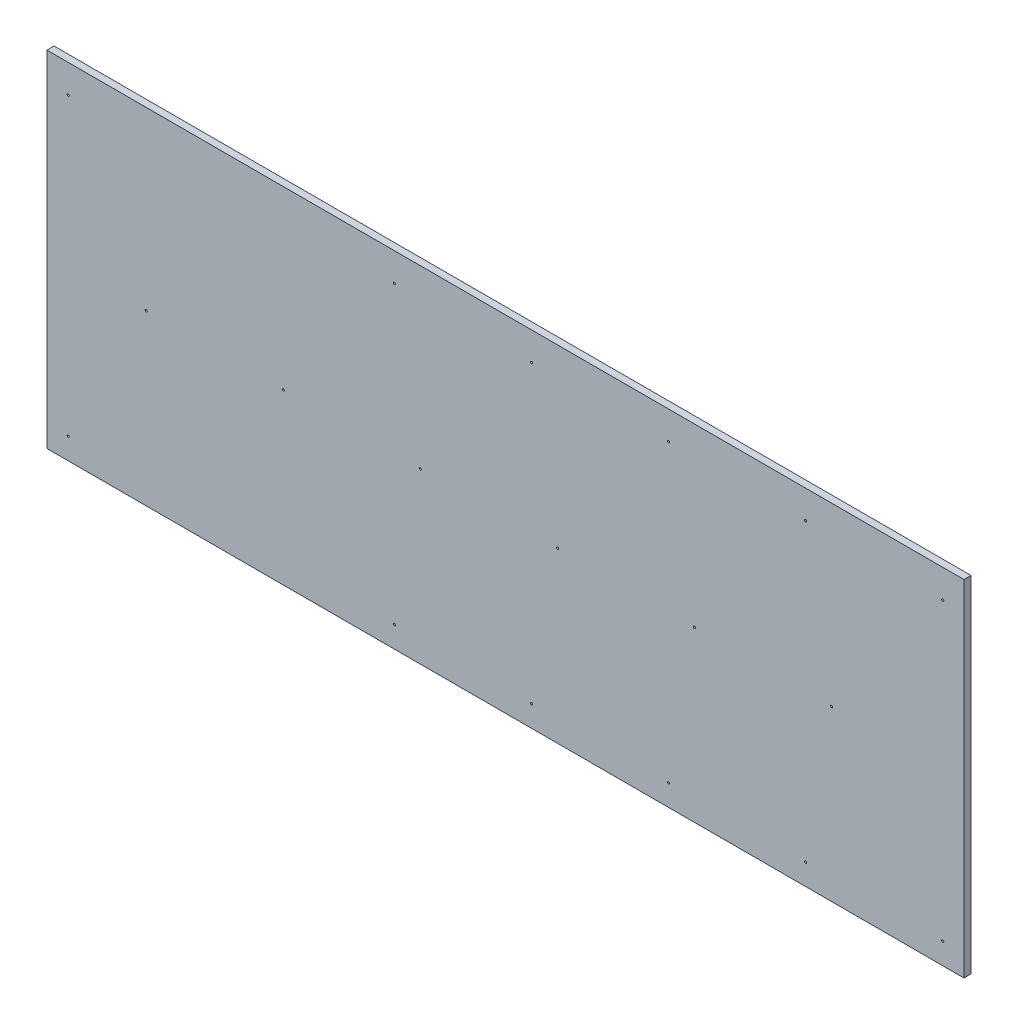
ISO-10303-21;
HEADER;
FILE_DESCRIPTION(('STEP AP214'),'2;1');
FILE_NAME('part.step','',(''),(''),'','','');
FILE_SCHEMA(('AUTOMOTIVE_DESIGN { 1 0 10303 214 1 1 1 1 }'));
ENDSEC;
DATA;
#1=APPLICATION_CONTEXT('core data for automotive mechanical design processes');
#2=APPLICATION_PROTOCOL_DEFINITION('international standard','automotive_design',2000,#1);
#3=PRODUCT_CONTEXT('',#1,'mechanical');
#4=PRODUCT('Part','Part','',(#3));
#5=PRODUCT_RELATED_PRODUCT_CATEGORY('part','',(#4));
#6=PRODUCT_DEFINITION_FORMATION('','',#4);
#7=PRODUCT_DEFINITION_CONTEXT('part definition',#1,'design');
#8=PRODUCT_DEFINITION('design','',#6,#7);
#9=PRODUCT_DEFINITION_SHAPE('','',#8);
#10=(LENGTH_UNIT() NAMED_UNIT(*) SI_UNIT(.MILLI.,.METRE.));
#11=(NAMED_UNIT(*) PLANE_ANGLE_UNIT() SI_UNIT($,.RADIAN.));
#12=(NAMED_UNIT(*) SI_UNIT($,.STERADIAN.) SOLID_ANGLE_UNIT());
#13=UNCERTAINTY_MEASURE_WITH_UNIT(LENGTH_MEASURE(1.E-05),#10,'distance_accuracy_value','');
#14=(GEOMETRIC_REPRESENTATION_CONTEXT(3) GLOBAL_UNCERTAINTY_ASSIGNED_CONTEXT((#13)) GLOBAL_UNIT_ASSIGNED_CONTEXT((#10,
#11,#12)) REPRESENTATION_CONTEXT('',''));
#15=CARTESIAN_POINT('',(0.,0.,0.));
#16=DIRECTION('',(0.,0.,1.));
#17=DIRECTION('',(1.,0.,0.));
#18=AXIS2_PLACEMENT_3D('',#15,#16,#17);
#19=CARTESIAN_POINT('',(-388.,-146.,6.));
#20=DIRECTION('',(1.,0.,0.));
#21=DIRECTION('',(0.,1.,0.));
#22=AXIS2_PLACEMENT_3D('',#19,#20,#21);
#23=PLANE('',#22);
#24=DIRECTION('',(0.,-1.,0.));
#25=VECTOR('',#24,1.);
#26=CARTESIAN_POINT('',(-388.,-146.,0.));
#27=LINE('',#26,#25);
#28=CARTESIAN_POINT('',(-388.,146.,0.));
#29=VERTEX_POINT('',#28);
#30=CARTESIAN_POINT('',(-388.,-146.,0.));
#31=VERTEX_POINT('',#30);
#32=EDGE_CURVE('E95',#29,#31,#27,.T.);
#33=ORIENTED_EDGE('',*,*,#32,.T.);
#34=DIRECTION('',(0.,0.,-1.));
#35=VECTOR('',#34,1.);
#36=CARTESIAN_POINT('',(-388.,-146.,6.));
#37=LINE('',#36,#35);
#38=CARTESIAN_POINT('',(-388.,-146.,6.));
#39=VERTEX_POINT('',#38);
#40=EDGE_CURVE('E11',#39,#31,#37,.T.);
#41=ORIENTED_EDGE('',*,*,#40,.F.);
#42=DIRECTION('',(0.,-1.,0.));
#43=VECTOR('',#42,1.);
#44=CARTESIAN_POINT('',(-388.,-146.,6.));
#45=LINE('',#44,#43);
#46=CARTESIAN_POINT('',(-388.,146.,6.));
#47=VERTEX_POINT('',#46);
#48=EDGE_CURVE('E83',#47,#39,#45,.T.);
#49=ORIENTED_EDGE('',*,*,#48,.F.);
#50=DIRECTION('',(0.,0.,-1.));
#51=VECTOR('',#50,1.);
#52=CARTESIAN_POINT('',(-388.,146.,6.));
#53=LINE('',#52,#51);
#54=EDGE_CURVE('E91',#47,#29,#53,.T.);
#55=ORIENTED_EDGE('',*,*,#54,.T.);
#56=EDGE_LOOP('',(#33,#41,#49,#55));
#57=FACE_BOUND('',#56,.T.);
#58=ADVANCED_FACE('F32',(#57),#23,.F.);
#59=CARTESIAN_POINT('',(388.,-146.,6.));
#60=DIRECTION('',(0.,1.,0.));
#61=DIRECTION('',(-1.,0.,0.));
#62=AXIS2_PLACEMENT_3D('',#59,#60,#61);
#63=PLANE('',#62);
#64=DIRECTION('',(1.,0.,0.));
#65=VECTOR('',#64,1.);
#66=CARTESIAN_POINT('',(388.,-146.,0.));
#67=LINE('',#66,#65);
#68=CARTESIAN_POINT('',(388.,-146.,0.));
#69=VERTEX_POINT('',#68);
#70=EDGE_CURVE('E87',#31,#69,#67,.T.);
#71=ORIENTED_EDGE('',*,*,#70,.T.);
#72=DIRECTION('',(0.,0.,-1.));
#73=VECTOR('',#72,1.);
#74=CARTESIAN_POINT('',(388.,-146.,6.));
#75=LINE('',#74,#73);
#76=CARTESIAN_POINT('',(388.,-146.,6.));
#77=VERTEX_POINT('',#76);
#78=EDGE_CURVE('E40',#77,#69,#75,.T.);
#79=ORIENTED_EDGE('',*,*,#78,.F.);
#80=DIRECTION('',(1.,0.,0.));
#81=VECTOR('',#80,1.);
#82=CARTESIAN_POINT('',(388.,-146.,6.));
#83=LINE('',#82,#81);
#84=EDGE_CURVE('E78',#39,#77,#83,.T.);
#85=ORIENTED_EDGE('',*,*,#84,.F.);
#86=ORIENTED_EDGE('',*,*,#40,.T.);
#87=EDGE_LOOP('',(#71,#79,#85,#86));
#88=FACE_BOUND('',#87,.T.);
#89=ADVANCED_FACE('F86',(#88),#63,.F.);
#90=CARTESIAN_POINT('',(388.,-146.,6.));
#91=DIRECTION('',(-1.,0.,0.));
#92=DIRECTION('',(0.,0.,1.));
#93=AXIS2_PLACEMENT_3D('',#90,#91,#92);
#94=PLANE('',#93);
#95=DIRECTION('',(0.,1.,0.));
#96=VECTOR('',#95,1.);
#97=CARTESIAN_POINT('',(388.,-146.,0.));
#98=LINE('',#97,#96);
#99=CARTESIAN_POINT('',(388.,146.,0.));
#100=VERTEX_POINT('',#99);
#101=EDGE_CURVE('E65',#69,#100,#98,.T.);
#102=ORIENTED_EDGE('',*,*,#101,.T.);
#103=DIRECTION('',(0.,0.,-1.));
#104=VECTOR('',#103,1.);
#105=CARTESIAN_POINT('',(388.,146.,6.));
#106=LINE('',#105,#104);
#107=CARTESIAN_POINT('',(388.,146.,6.));
#108=VERTEX_POINT('',#107);
#109=EDGE_CURVE('E88',#108,#100,#106,.T.);
#110=ORIENTED_EDGE('',*,*,#109,.F.);
#111=DIRECTION('',(0.,1.,0.));
#112=VECTOR('',#111,1.);
#113=CARTESIAN_POINT('',(388.,-146.,6.));
#114=LINE('',#113,#112);
#115=EDGE_CURVE('E81',#77,#108,#114,.T.);
#116=ORIENTED_EDGE('',*,*,#115,.F.);
#117=ORIENTED_EDGE('',*,*,#78,.T.);
#118=EDGE_LOOP('',(#102,#110,#116,#117));
#119=FACE_BOUND('',#118,.T.);
#120=ADVANCED_FACE('F89',(#119),#94,.F.);
#121=CARTESIAN_POINT('',(388.,146.,6.));
#122=DIRECTION('',(0.,-1.,0.));
#123=DIRECTION('',(1.,0.,0.));
#124=AXIS2_PLACEMENT_3D('',#121,#122,#123);
#125=PLANE('',#124);
#126=DIRECTION('',(-1.,0.,0.));
#127=VECTOR('',#126,1.);
#128=CARTESIAN_POINT('',(388.,146.,0.));
#129=LINE('',#128,#127);
#130=EDGE_CURVE('E71',#100,#29,#129,.T.);
#131=ORIENTED_EDGE('',*,*,#130,.T.);
#132=ORIENTED_EDGE('',*,*,#54,.F.);
#133=DIRECTION('',(-1.,0.,0.));
#134=VECTOR('',#133,1.);
#135=CARTESIAN_POINT('',(388.,146.,6.));
#136=LINE('',#135,#134);
#137=EDGE_CURVE('E48',#108,#47,#136,.T.);
#138=ORIENTED_EDGE('',*,*,#137,.F.);
#139=ORIENTED_EDGE('',*,*,#109,.T.);
#140=EDGE_LOOP('',(#131,#132,#138,#139));
#141=FACE_BOUND('',#140,.T.);
#142=ADVANCED_FACE('F103',(#141),#125,.F.);
#143=CARTESIAN_POINT('',(0.,0.,6.));
#144=DIRECTION('',(0.,0.,1.));
#145=DIRECTION('',(1.,0.,0.));
#146=AXIS2_PLACEMENT_3D('',#143,#144,#145);
#147=PLANE('',#146);
#148=CARTESIAN_POINT('',(-71.9999999999997,-2.99999999999988,6.));
#149=DIRECTION('',(0.,0.,-1.));
#150=DIRECTION('',(-1.,0.,0.));
#151=AXIS2_PLACEMENT_3D('',#148,#149,#150);
#152=CIRCLE('',#151,0.900000000000005);
#153=CARTESIAN_POINT('',(-72.8999999999997,-2.99999999999988,6.));
#154=VERTEX_POINT('',#153);
#155=EDGE_CURVE('E173',#154,#154,#152,.T.);
#156=ORIENTED_EDGE('',*,*,#155,.T.);
#157=EDGE_LOOP('',(#156));
#158=FACE_BOUND('',#157,.T.);
#159=CARTESIAN_POINT('',(-93.9999999999997,-128.,6.));
#160=DIRECTION('',(0.,0.,-1.));
#161=DIRECTION('',(-1.,0.,0.));
#162=AXIS2_PLACEMENT_3D('',#159,#160,#161);
#163=CIRCLE('',#162,0.900000000000007);
#164=CARTESIAN_POINT('',(-94.8999999999997,-128.,6.));
#165=VERTEX_POINT('',#164);
#166=EDGE_CURVE('E166',#165,#165,#163,.T.);
#167=ORIENTED_EDGE('',*,*,#166,.T.);
#168=EDGE_LOOP('',(#167));
#169=FACE_BOUND('',#168,.T.);
#170=CARTESIAN_POINT('',(-93.9999999999997,122.,6.));
#171=DIRECTION('',(0.,0.,-1.));
#172=DIRECTION('',(-1.,0.,0.));
#173=AXIS2_PLACEMENT_3D('',#170,#171,#172);
#174=CIRCLE('',#173,0.900000000000003);
#175=CARTESIAN_POINT('',(-94.8999999999997,122.,6.));
#176=VERTEX_POINT('',#175);
#177=EDGE_CURVE('E167',#176,#176,#174,.T.);
#178=ORIENTED_EDGE('',*,*,#177,.T.);
#179=EDGE_LOOP('',(#178));
#180=FACE_BOUND('',#179,.T.);
#181=CARTESIAN_POINT('',(-188.,-2.99999999999988,6.));
#182=DIRECTION('',(0.,0.,-1.));
#183=DIRECTION('',(-1.,0.,0.));
#184=AXIS2_PLACEMENT_3D('',#181,#182,#183);
#185=CIRCLE('',#184,0.900000000000005);
#186=CARTESIAN_POINT('',(-188.9,-2.99999999999988,6.));
#187=VERTEX_POINT('',#186);
#188=EDGE_CURVE('E186',#187,#187,#185,.T.);
#189=ORIENTED_EDGE('',*,*,#188,.T.);
#190=EDGE_LOOP('',(#189));
#191=FACE_BOUND('',#190,.T.);
#192=CARTESIAN_POINT('',(-304.,-2.99999999999988,6.));
#193=DIRECTION('',(0.,0.,-1.));
#194=DIRECTION('',(-1.,0.,0.));
#195=AXIS2_PLACEMENT_3D('',#192,#193,#194);
#196=CIRCLE('',#195,0.900000000000005);
#197=CARTESIAN_POINT('',(-304.9,-2.99999999999988,6.));
#198=VERTEX_POINT('',#197);
#199=EDGE_CURVE('E180',#198,#198,#196,.T.);
#200=ORIENTED_EDGE('',*,*,#199,.T.);
#201=EDGE_LOOP('',(#200));
#202=FACE_BOUND('',#201,.T.);
#203=CARTESIAN_POINT('',(22.0000000000003,122.,6.));
#204=DIRECTION('',(0.,0.,-1.));
#205=DIRECTION('',(-1.,0.,0.));
#206=AXIS2_PLACEMENT_3D('',#203,#204,#205);
#207=CIRCLE('',#206,0.900000000000003);
#208=CARTESIAN_POINT('',(21.1000000000003,122.,6.));
#209=VERTEX_POINT('',#208);
#210=EDGE_CURVE('E196',#209,#209,#207,.T.);
#211=ORIENTED_EDGE('',*,*,#210,.T.);
#212=EDGE_LOOP('',(#211));
#213=FACE_BOUND('',#212,.T.);
#214=CARTESIAN_POINT('',(22.0000000000003,-128.,6.));
#215=DIRECTION('',(0.,0.,-1.));
#216=DIRECTION('',(-1.,0.,0.));
#217=AXIS2_PLACEMENT_3D('',#214,#215,#216);
#218=CIRCLE('',#217,0.900000000000007);
#219=CARTESIAN_POINT('',(21.1000000000003,-128.,6.));
#220=VERTEX_POINT('',#219);
#221=EDGE_CURVE('E202',#220,#220,#218,.T.);
#222=ORIENTED_EDGE('',*,*,#221,.T.);
#223=EDGE_LOOP('',(#222));
#224=FACE_BOUND('',#223,.T.);
#225=CARTESIAN_POINT('',(44.0000000000003,-2.99999999999988,6.));
#226=DIRECTION('',(0.,0.,-1.));
#227=DIRECTION('',(-1.,0.,0.));
#228=AXIS2_PLACEMENT_3D('',#225,#226,#227);
#229=CIRCLE('',#228,0.900000000000005);
#230=CARTESIAN_POINT('',(43.1000000000003,-2.99999999999988,6.));
#231=VERTEX_POINT('',#230);
#232=EDGE_CURVE('E208',#231,#231,#229,.T.);
#233=ORIENTED_EDGE('',*,*,#232,.T.);
#234=EDGE_LOOP('',(#233));
#235=FACE_BOUND('',#234,.T.);
#236=CARTESIAN_POINT('',(138.,122.,6.));
#237=DIRECTION('',(0.,0.,-1.));
#238=DIRECTION('',(-1.,0.,0.));
#239=AXIS2_PLACEMENT_3D('',#236,#237,#238);
#240=CIRCLE('',#239,0.900000000000003);
#241=CARTESIAN_POINT('',(137.1,122.,6.));
#242=VERTEX_POINT('',#241);
#243=EDGE_CURVE('E143',#242,#242,#240,.T.);
#244=ORIENTED_EDGE('',*,*,#243,.T.);
#245=EDGE_LOOP('',(#244));
#246=FACE_BOUND('',#245,.T.);
#247=CARTESIAN_POINT('',(276.,-2.99999999999988,6.));
#248=DIRECTION('',(0.,0.,-1.));
#249=DIRECTION('',(-1.,0.,0.));
#250=AXIS2_PLACEMENT_3D('',#247,#248,#249);
#251=CIRCLE('',#250,0.900000000000005);
#252=CARTESIAN_POINT('',(275.1,-2.99999999999988,6.));
#253=VERTEX_POINT('',#252);
#254=EDGE_CURVE('E130',#253,#253,#251,.T.);
#255=ORIENTED_EDGE('',*,*,#254,.T.);
#256=EDGE_LOOP('',(#255));
#257=FACE_BOUND('',#256,.T.);
#258=CARTESIAN_POINT('',(-370.,122.,6.));
#259=DIRECTION('',(0.,0.,-1.));
#260=DIRECTION('',(-1.,0.,0.));
#261=AXIS2_PLACEMENT_3D('',#258,#259,#260);
#262=CIRCLE('',#261,0.900000000000003);
#263=CARTESIAN_POINT('',(-370.9,122.,6.));
#264=VERTEX_POINT('',#263);
#265=EDGE_CURVE('E119',#264,#264,#262,.T.);
#266=ORIENTED_EDGE('',*,*,#265,.T.);
#267=EDGE_LOOP('',(#266));
#268=FACE_BOUND('',#267,.T.);
#269=CARTESIAN_POINT('',(-370.,-128.,6.));
#270=DIRECTION('',(0.,0.,-1.));
#271=DIRECTION('',(-1.,0.,0.));
#272=AXIS2_PLACEMENT_3D('',#269,#270,#271);
#273=CIRCLE('',#272,0.900000000000007);
#274=CARTESIAN_POINT('',(-370.9,-128.,6.));
#275=VERTEX_POINT('',#274);
#276=EDGE_CURVE('E118',#275,#275,#273,.T.);
#277=ORIENTED_EDGE('',*,*,#276,.T.);
#278=EDGE_LOOP('',(#277));
#279=FACE_BOUND('',#278,.T.);
#280=CARTESIAN_POINT('',(370.,122.,6.));
#281=DIRECTION('',(0.,0.,-1.));
#282=DIRECTION('',(-1.,0.,0.));
#283=AXIS2_PLACEMENT_3D('',#280,#281,#282);
#284=CIRCLE('',#283,0.900000000000003);
#285=CARTESIAN_POINT('',(369.1,122.,6.));
#286=VERTEX_POINT('',#285);
#287=EDGE_CURVE('E112',#286,#286,#284,.T.);
#288=ORIENTED_EDGE('',*,*,#287,.T.);
#289=EDGE_LOOP('',(#288));
#290=FACE_BOUND('',#289,.T.);
#291=CARTESIAN_POINT('',(254.,-128.,6.));
#292=DIRECTION('',(0.,0.,-1.));
#293=DIRECTION('',(-1.,0.,0.));
#294=AXIS2_PLACEMENT_3D('',#291,#292,#293);
#295=CIRCLE('',#294,0.900000000000007);
#296=CARTESIAN_POINT('',(253.1,-128.,6.));
#297=VERTEX_POINT('',#296);
#298=EDGE_CURVE('E131',#297,#297,#295,.T.);
#299=ORIENTED_EDGE('',*,*,#298,.T.);
#300=EDGE_LOOP('',(#299));
#301=FACE_BOUND('',#300,.T.);
#302=CARTESIAN_POINT('',(254.,122.,6.));
#303=DIRECTION('',(0.,0.,-1.));
#304=DIRECTION('',(-1.,0.,0.));
#305=AXIS2_PLACEMENT_3D('',#302,#303,#304);
#306=CIRCLE('',#305,0.900000000000003);
#307=CARTESIAN_POINT('',(253.1,122.,6.));
#308=VERTEX_POINT('',#307);
#309=EDGE_CURVE('E155',#308,#308,#306,.T.);
#310=ORIENTED_EDGE('',*,*,#309,.T.);
#311=EDGE_LOOP('',(#310));
#312=FACE_BOUND('',#311,.T.);
#313=CARTESIAN_POINT('',(160.,-2.99999999999988,6.));
#314=DIRECTION('',(0.,0.,-1.));
#315=DIRECTION('',(-1.,0.,0.));
#316=AXIS2_PLACEMENT_3D('',#313,#314,#315);
#317=CIRCLE('',#316,0.900000000000005);
#318=CARTESIAN_POINT('',(159.1,-2.99999999999988,6.));
#319=VERTEX_POINT('',#318);
#320=EDGE_CURVE('E149',#319,#319,#317,.T.);
#321=ORIENTED_EDGE('',*,*,#320,.T.);
#322=EDGE_LOOP('',(#321));
#323=FACE_BOUND('',#322,.T.);
#324=CARTESIAN_POINT('',(138.,-128.,6.));
#325=DIRECTION('',(0.,0.,-1.));
#326=DIRECTION('',(-1.,0.,0.));
#327=AXIS2_PLACEMENT_3D('',#324,#325,#326);
#328=CIRCLE('',#327,0.900000000000007);
#329=CARTESIAN_POINT('',(137.1,-128.,6.));
#330=VERTEX_POINT('',#329);
#331=EDGE_CURVE('E142',#330,#330,#328,.T.);
#332=ORIENTED_EDGE('',*,*,#331,.T.);
#333=EDGE_LOOP('',(#332));
#334=FACE_BOUND('',#333,.T.);
#335=CARTESIAN_POINT('',(370.,-128.,6.));
#336=DIRECTION('',(0.,0.,-1.));
#337=DIRECTION('',(-1.,0.,0.));
#338=AXIS2_PLACEMENT_3D('',#335,#336,#337);
#339=CIRCLE('',#338,0.900000000000007);
#340=CARTESIAN_POINT('',(369.1,-128.,6.));
#341=VERTEX_POINT('',#340);
#342=EDGE_CURVE('E98',#341,#341,#339,.T.);
#343=ORIENTED_EDGE('',*,*,#342,.T.);
#344=EDGE_LOOP('',(#343));
#345=FACE_BOUND('',#344,.T.);
#346=ORIENTED_EDGE('',*,*,#48,.T.);
#347=ORIENTED_EDGE('',*,*,#84,.T.);
#348=ORIENTED_EDGE('',*,*,#115,.T.);
#349=ORIENTED_EDGE('',*,*,#137,.T.);
#350=EDGE_LOOP('',(#346,#347,#348,#349));
#351=FACE_BOUND('',#350,.T.);
#352=ADVANCED_FACE('F79',(#158,#169,#180,#191,#202,#213,#224,#235,#246,#257,#268,#279,#290,#301,
#312,#323,#334,#345,#351),#147,.T.);
#353=CARTESIAN_POINT('',(0.,0.,0.));
#354=DIRECTION('',(0.,0.,1.));
#355=DIRECTION('',(1.,0.,0.));
#356=AXIS2_PLACEMENT_3D('',#353,#354,#355);
#357=PLANE('',#356);
#358=CARTESIAN_POINT('',(-71.9999999999997,-2.99999999999988,0.));
#359=DIRECTION('',(0.,0.,-1.));
#360=DIRECTION('',(-1.,0.,0.));
#361=AXIS2_PLACEMENT_3D('',#358,#359,#360);
#362=CIRCLE('',#361,0.900000000000005);
#363=CARTESIAN_POINT('',(-72.8999999999997,-2.99999999999988,0.));
#364=VERTEX_POINT('',#363);
#365=EDGE_CURVE('E170',#364,#364,#362,.T.);
#366=ORIENTED_EDGE('',*,*,#365,.F.);
#367=EDGE_LOOP('',(#366));
#368=FACE_BOUND('',#367,.T.);
#369=CARTESIAN_POINT('',(-93.9999999999997,-128.,0.));
#370=DIRECTION('',(0.,0.,-1.));
#371=DIRECTION('',(-1.,0.,0.));
#372=AXIS2_PLACEMENT_3D('',#369,#370,#371);
#373=CIRCLE('',#372,0.900000000000007);
#374=CARTESIAN_POINT('',(-94.8999999999997,-128.,0.));
#375=VERTEX_POINT('',#374);
#376=EDGE_CURVE('E163',#375,#375,#373,.T.);
#377=ORIENTED_EDGE('',*,*,#376,.F.);
#378=EDGE_LOOP('',(#377));
#379=FACE_BOUND('',#378,.T.);
#380=CARTESIAN_POINT('',(-93.9999999999997,122.,0.));
#381=DIRECTION('',(0.,0.,-1.));
#382=DIRECTION('',(-1.,0.,0.));
#383=AXIS2_PLACEMENT_3D('',#380,#381,#382);
#384=CIRCLE('',#383,0.900000000000003);
#385=CARTESIAN_POINT('',(-94.8999999999997,122.,0.));
#386=VERTEX_POINT('',#385);
#387=EDGE_CURVE('E189',#386,#386,#384,.T.);
#388=ORIENTED_EDGE('',*,*,#387,.F.);
#389=EDGE_LOOP('',(#388));
#390=FACE_BOUND('',#389,.T.);
#391=CARTESIAN_POINT('',(-188.,-2.99999999999988,0.));
#392=DIRECTION('',(0.,0.,-1.));
#393=DIRECTION('',(-1.,0.,0.));
#394=AXIS2_PLACEMENT_3D('',#391,#392,#393);
#395=CIRCLE('',#394,0.900000000000005);
#396=CARTESIAN_POINT('',(-188.9,-2.99999999999988,0.));
#397=VERTEX_POINT('',#396);
#398=EDGE_CURVE('E183',#397,#397,#395,.T.);
#399=ORIENTED_EDGE('',*,*,#398,.F.);
#400=EDGE_LOOP('',(#399));
#401=FACE_BOUND('',#400,.T.);
#402=CARTESIAN_POINT('',(-304.,-2.99999999999988,0.));
#403=DIRECTION('',(0.,0.,-1.));
#404=DIRECTION('',(-1.,0.,0.));
#405=AXIS2_PLACEMENT_3D('',#402,#403,#404);
#406=CIRCLE('',#405,0.900000000000005);
#407=CARTESIAN_POINT('',(-304.9,-2.99999999999988,0.));
#408=VERTEX_POINT('',#407);
#409=EDGE_CURVE('E177',#408,#408,#406,.T.);
#410=ORIENTED_EDGE('',*,*,#409,.F.);
#411=EDGE_LOOP('',(#410));
#412=FACE_BOUND('',#411,.T.);
#413=CARTESIAN_POINT('',(22.0000000000003,122.,0.));
#414=DIRECTION('',(0.,0.,-1.));
#415=DIRECTION('',(-1.,0.,0.));
#416=AXIS2_PLACEMENT_3D('',#413,#414,#415);
#417=CIRCLE('',#416,0.900000000000003);
#418=CARTESIAN_POINT('',(21.1000000000003,122.,0.));
#419=VERTEX_POINT('',#418);
#420=EDGE_CURVE('E176',#419,#419,#417,.T.);
#421=ORIENTED_EDGE('',*,*,#420,.F.);
#422=EDGE_LOOP('',(#421));
#423=FACE_BOUND('',#422,.T.);
#424=CARTESIAN_POINT('',(22.0000000000003,-128.,0.));
#425=DIRECTION('',(0.,0.,-1.));
#426=DIRECTION('',(-1.,0.,0.));
#427=AXIS2_PLACEMENT_3D('',#424,#425,#426);
#428=CIRCLE('',#427,0.900000000000007);
#429=CARTESIAN_POINT('',(21.1000000000003,-128.,0.));
#430=VERTEX_POINT('',#429);
#431=EDGE_CURVE('E199',#430,#430,#428,.T.);
#432=ORIENTED_EDGE('',*,*,#431,.F.);
#433=EDGE_LOOP('',(#432));
#434=FACE_BOUND('',#433,.T.);
#435=CARTESIAN_POINT('',(44.0000000000003,-2.99999999999988,0.));
#436=DIRECTION('',(0.,0.,-1.));
#437=DIRECTION('',(-1.,0.,0.));
#438=AXIS2_PLACEMENT_3D('',#435,#436,#437);
#439=CIRCLE('',#438,0.900000000000005);
#440=CARTESIAN_POINT('',(43.1000000000003,-2.99999999999988,0.));
#441=VERTEX_POINT('',#440);
#442=EDGE_CURVE('E205',#441,#441,#439,.T.);
#443=ORIENTED_EDGE('',*,*,#442,.F.);
#444=EDGE_LOOP('',(#443));
#445=FACE_BOUND('',#444,.T.);
#446=CARTESIAN_POINT('',(138.,122.,0.));
#447=DIRECTION('',(0.,0.,-1.));
#448=DIRECTION('',(-1.,0.,0.));
#449=AXIS2_PLACEMENT_3D('',#446,#447,#448);
#450=CIRCLE('',#449,0.900000000000003);
#451=CARTESIAN_POINT('',(137.1,122.,0.));
#452=VERTEX_POINT('',#451);
#453=EDGE_CURVE('E211',#452,#452,#450,.T.);
#454=ORIENTED_EDGE('',*,*,#453,.F.);
#455=EDGE_LOOP('',(#454));
#456=FACE_BOUND('',#455,.T.);
#457=CARTESIAN_POINT('',(276.,-2.99999999999988,0.));
#458=DIRECTION('',(0.,0.,-1.));
#459=DIRECTION('',(-1.,0.,0.));
#460=AXIS2_PLACEMENT_3D('',#457,#458,#459);
#461=CIRCLE('',#460,0.900000000000005);
#462=CARTESIAN_POINT('',(275.1,-2.99999999999988,0.));
#463=VERTEX_POINT('',#462);
#464=EDGE_CURVE('E127',#463,#463,#461,.T.);
#465=ORIENTED_EDGE('',*,*,#464,.F.);
#466=EDGE_LOOP('',(#465));
#467=FACE_BOUND('',#466,.T.);
#468=CARTESIAN_POINT('',(-370.,122.,0.));
#469=DIRECTION('',(0.,0.,-1.));
#470=DIRECTION('',(-1.,0.,0.));
#471=AXIS2_PLACEMENT_3D('',#468,#469,#470);
#472=CIRCLE('',#471,0.900000000000003);
#473=CARTESIAN_POINT('',(-370.9,122.,0.));
#474=VERTEX_POINT('',#473);
#475=EDGE_CURVE('E134',#474,#474,#472,.T.);
#476=ORIENTED_EDGE('',*,*,#475,.F.);
#477=EDGE_LOOP('',(#476));
#478=FACE_BOUND('',#477,.T.);
#479=CARTESIAN_POINT('',(-370.,-128.,0.));
#480=DIRECTION('',(0.,0.,-1.));
#481=DIRECTION('',(-1.,0.,0.));
#482=AXIS2_PLACEMENT_3D('',#479,#480,#481);
#483=CIRCLE('',#482,0.900000000000007);
#484=CARTESIAN_POINT('',(-370.9,-128.,0.));
#485=VERTEX_POINT('',#484);
#486=EDGE_CURVE('E115',#485,#485,#483,.T.);
#487=ORIENTED_EDGE('',*,*,#486,.F.);
#488=EDGE_LOOP('',(#487));
#489=FACE_BOUND('',#488,.T.);
#490=CARTESIAN_POINT('',(370.,122.,0.));
#491=DIRECTION('',(0.,0.,-1.));
#492=DIRECTION('',(-1.,0.,0.));
#493=AXIS2_PLACEMENT_3D('',#490,#491,#492);
#494=CIRCLE('',#493,0.900000000000003);
#495=CARTESIAN_POINT('',(369.1,122.,0.));
#496=VERTEX_POINT('',#495);
#497=EDGE_CURVE('E122',#496,#496,#494,.T.);
#498=ORIENTED_EDGE('',*,*,#497,.F.);
#499=EDGE_LOOP('',(#498));
#500=FACE_BOUND('',#499,.T.);
#501=CARTESIAN_POINT('',(254.,-128.,0.));
#502=DIRECTION('',(0.,0.,-1.));
#503=DIRECTION('',(-1.,0.,0.));
#504=AXIS2_PLACEMENT_3D('',#501,#502,#503);
#505=CIRCLE('',#504,0.900000000000007);
#506=CARTESIAN_POINT('',(253.1,-128.,0.));
#507=VERTEX_POINT('',#506);
#508=EDGE_CURVE('E158',#507,#507,#505,.T.);
#509=ORIENTED_EDGE('',*,*,#508,.F.);
#510=EDGE_LOOP('',(#509));
#511=FACE_BOUND('',#510,.T.);
#512=CARTESIAN_POINT('',(254.,122.,0.));
#513=DIRECTION('',(0.,0.,-1.));
#514=DIRECTION('',(-1.,0.,0.));
#515=AXIS2_PLACEMENT_3D('',#512,#513,#514);
#516=CIRCLE('',#515,0.900000000000003);
#517=CARTESIAN_POINT('',(253.1,122.,0.));
#518=VERTEX_POINT('',#517);
#519=EDGE_CURVE('E152',#518,#518,#516,.T.);
#520=ORIENTED_EDGE('',*,*,#519,.F.);
#521=EDGE_LOOP('',(#520));
#522=FACE_BOUND('',#521,.T.);
#523=CARTESIAN_POINT('',(160.,-2.99999999999988,0.));
#524=DIRECTION('',(0.,0.,-1.));
#525=DIRECTION('',(-1.,0.,0.));
#526=AXIS2_PLACEMENT_3D('',#523,#524,#525);
#527=CIRCLE('',#526,0.900000000000005);
#528=CARTESIAN_POINT('',(159.1,-2.99999999999988,0.));
#529=VERTEX_POINT('',#528);
#530=EDGE_CURVE('E146',#529,#529,#527,.T.);
#531=ORIENTED_EDGE('',*,*,#530,.F.);
#532=EDGE_LOOP('',(#531));
#533=FACE_BOUND('',#532,.T.);
#534=CARTESIAN_POINT('',(138.,-128.,0.));
#535=DIRECTION('',(0.,0.,-1.));
#536=DIRECTION('',(-1.,0.,0.));
#537=AXIS2_PLACEMENT_3D('',#534,#535,#536);
#538=CIRCLE('',#537,0.900000000000007);
#539=CARTESIAN_POINT('',(137.1,-128.,0.));
#540=VERTEX_POINT('',#539);
#541=EDGE_CURVE('E139',#540,#540,#538,.T.);
#542=ORIENTED_EDGE('',*,*,#541,.F.);
#543=EDGE_LOOP('',(#542));
#544=FACE_BOUND('',#543,.T.);
#545=CARTESIAN_POINT('',(370.,-128.,0.));
#546=DIRECTION('',(0.,0.,-1.));
#547=DIRECTION('',(-1.,0.,0.));
#548=AXIS2_PLACEMENT_3D('',#545,#546,#547);
#549=CIRCLE('',#548,0.900000000000007);
#550=CARTESIAN_POINT('',(369.1,-128.,0.));
#551=VERTEX_POINT('',#550);
#552=EDGE_CURVE('E109',#551,#551,#549,.T.);
#553=ORIENTED_EDGE('',*,*,#552,.F.);
#554=EDGE_LOOP('',(#553));
#555=FACE_BOUND('',#554,.T.);
#556=ORIENTED_EDGE('',*,*,#32,.F.);
#557=ORIENTED_EDGE('',*,*,#130,.F.);
#558=ORIENTED_EDGE('',*,*,#101,.F.);
#559=ORIENTED_EDGE('',*,*,#70,.F.);
#560=EDGE_LOOP('',(#556,#557,#558,#559));
#561=FACE_BOUND('',#560,.T.);
#562=ADVANCED_FACE('F106',(#368,#379,#390,#401,#412,#423,#434,#445,#456,#467,#478,#489,#500,
#511,#522,#533,#544,#555,#561),#357,.F.);
#563=CARTESIAN_POINT('',(370.,-128.,6.));
#564=DIRECTION('',(0.,0.,-1.));
#565=DIRECTION('',(-1.,0.,0.));
#566=AXIS2_PLACEMENT_3D('',#563,#564,#565);
#567=CYLINDRICAL_SURFACE('',#566,0.900000000000007);
#568=ORIENTED_EDGE('',*,*,#342,.F.);
#569=EDGE_LOOP('',(#568));
#570=FACE_BOUND('',#569,.T.);
#571=ORIENTED_EDGE('',*,*,#552,.T.);
#572=EDGE_LOOP('',(#571));
#573=FACE_BOUND('',#572,.T.);
#574=ADVANCED_FACE('F229',(#570,#573),#567,.F.);
#575=CARTESIAN_POINT('',(138.,-128.,6.));
#576=DIRECTION('',(0.,0.,-1.));
#577=DIRECTION('',(-1.,0.,0.));
#578=AXIS2_PLACEMENT_3D('',#575,#576,#577);
#579=CYLINDRICAL_SURFACE('',#578,0.900000000000007);
#580=ORIENTED_EDGE('',*,*,#331,.F.);
#581=EDGE_LOOP('',(#580));
#582=FACE_BOUND('',#581,.T.);
#583=ORIENTED_EDGE('',*,*,#541,.T.);
#584=EDGE_LOOP('',(#583));
#585=FACE_BOUND('',#584,.T.);
#586=ADVANCED_FACE('F251',(#582,#585),#579,.F.);
#587=CARTESIAN_POINT('',(160.,-2.99999999999988,6.));
#588=DIRECTION('',(0.,0.,-1.));
#589=DIRECTION('',(-1.,0.,0.));
#590=AXIS2_PLACEMENT_3D('',#587,#588,#589);
#591=CYLINDRICAL_SURFACE('',#590,0.900000000000005);
#592=ORIENTED_EDGE('',*,*,#320,.F.);
#593=EDGE_LOOP('',(#592));
#594=FACE_BOUND('',#593,.T.);
#595=ORIENTED_EDGE('',*,*,#530,.T.);
#596=EDGE_LOOP('',(#595));
#597=FACE_BOUND('',#596,.T.);
#598=ADVANCED_FACE('F257',(#594,#597),#591,.F.);
#599=CARTESIAN_POINT('',(254.,122.,6.));
#600=DIRECTION('',(0.,0.,-1.));
#601=DIRECTION('',(-1.,0.,0.));
#602=AXIS2_PLACEMENT_3D('',#599,#600,#601);
#603=CYLINDRICAL_SURFACE('',#602,0.900000000000003);
#604=ORIENTED_EDGE('',*,*,#309,.F.);
#605=EDGE_LOOP('',(#604));
#606=FACE_BOUND('',#605,.T.);
#607=ORIENTED_EDGE('',*,*,#519,.T.);
#608=EDGE_LOOP('',(#607));
#609=FACE_BOUND('',#608,.T.);
#610=ADVANCED_FACE('F333',(#606,#609),#603,.F.);
#611=CARTESIAN_POINT('',(254.,-128.,6.));
#612=DIRECTION('',(0.,0.,-1.));
#613=DIRECTION('',(-1.,0.,0.));
#614=AXIS2_PLACEMENT_3D('',#611,#612,#613);
#615=CYLINDRICAL_SURFACE('',#614,0.900000000000007);
#616=ORIENTED_EDGE('',*,*,#298,.F.);
#617=EDGE_LOOP('',(#616));
#618=FACE_BOUND('',#617,.T.);
#619=ORIENTED_EDGE('',*,*,#508,.T.);
#620=EDGE_LOOP('',(#619));
#621=FACE_BOUND('',#620,.T.);
#622=ADVANCED_FACE('F329',(#618,#621),#615,.F.);
#623=CARTESIAN_POINT('',(370.,122.,6.));
#624=DIRECTION('',(0.,0.,-1.));
#625=DIRECTION('',(-1.,0.,0.));
#626=AXIS2_PLACEMENT_3D('',#623,#624,#625);
#627=CYLINDRICAL_SURFACE('',#626,0.900000000000003);
#628=ORIENTED_EDGE('',*,*,#287,.F.);
#629=EDGE_LOOP('',(#628));
#630=FACE_BOUND('',#629,.T.);
#631=ORIENTED_EDGE('',*,*,#497,.T.);
#632=EDGE_LOOP('',(#631));
#633=FACE_BOUND('',#632,.T.);
#634=ADVANCED_FACE('F332',(#630,#633),#627,.F.);
#635=CARTESIAN_POINT('',(-370.,-128.,6.));
#636=DIRECTION('',(0.,0.,-1.));
#637=DIRECTION('',(-1.,0.,0.));
#638=AXIS2_PLACEMENT_3D('',#635,#636,#637);
#639=CYLINDRICAL_SURFACE('',#638,0.900000000000007);
#640=ORIENTED_EDGE('',*,*,#276,.F.);
#641=EDGE_LOOP('',(#640));
#642=FACE_BOUND('',#641,.T.);
#643=ORIENTED_EDGE('',*,*,#486,.T.);
#644=EDGE_LOOP('',(#643));
#645=FACE_BOUND('',#644,.T.);
#646=ADVANCED_FACE('F344',(#642,#645),#639,.F.);
#647=CARTESIAN_POINT('',(-370.,122.,6.));
#648=DIRECTION('',(0.,0.,-1.));
#649=DIRECTION('',(-1.,0.,0.));
#650=AXIS2_PLACEMENT_3D('',#647,#648,#649);
#651=CYLINDRICAL_SURFACE('',#650,0.900000000000003);
#652=ORIENTED_EDGE('',*,*,#265,.F.);
#653=EDGE_LOOP('',(#652));
#654=FACE_BOUND('',#653,.T.);
#655=ORIENTED_EDGE('',*,*,#475,.T.);
#656=EDGE_LOOP('',(#655));
#657=FACE_BOUND('',#656,.T.);
#658=ADVANCED_FACE('F341',(#654,#657),#651,.F.);
#659=CARTESIAN_POINT('',(276.,-2.99999999999988,6.));
#660=DIRECTION('',(0.,0.,-1.));
#661=DIRECTION('',(-1.,0.,0.));
#662=AXIS2_PLACEMENT_3D('',#659,#660,#661);
#663=CYLINDRICAL_SURFACE('',#662,0.900000000000005);
#664=ORIENTED_EDGE('',*,*,#254,.F.);
#665=EDGE_LOOP('',(#664));
#666=FACE_BOUND('',#665,.T.);
#667=ORIENTED_EDGE('',*,*,#464,.T.);
#668=EDGE_LOOP('',(#667));
#669=FACE_BOUND('',#668,.T.);
#670=ADVANCED_FACE('F223',(#666,#669),#663,.F.);
#671=CARTESIAN_POINT('',(138.,122.,6.));
#672=DIRECTION('',(0.,0.,-1.));
#673=DIRECTION('',(-1.,0.,0.));
#674=AXIS2_PLACEMENT_3D('',#671,#672,#673);
#675=CYLINDRICAL_SURFACE('',#674,0.900000000000003);
#676=ORIENTED_EDGE('',*,*,#243,.F.);
#677=EDGE_LOOP('',(#676));
#678=FACE_BOUND('',#677,.T.);
#679=ORIENTED_EDGE('',*,*,#453,.T.);
#680=EDGE_LOOP('',(#679));
#681=FACE_BOUND('',#680,.T.);
#682=ADVANCED_FACE('F219',(#678,#681),#675,.F.);
#683=CARTESIAN_POINT('',(44.0000000000003,-2.99999999999988,6.));
#684=DIRECTION('',(0.,0.,-1.));
#685=DIRECTION('',(-1.,0.,0.));
#686=AXIS2_PLACEMENT_3D('',#683,#684,#685);
#687=CYLINDRICAL_SURFACE('',#686,0.900000000000005);
#688=ORIENTED_EDGE('',*,*,#232,.F.);
#689=EDGE_LOOP('',(#688));
#690=FACE_BOUND('',#689,.T.);
#691=ORIENTED_EDGE('',*,*,#442,.T.);
#692=EDGE_LOOP('',(#691));
#693=FACE_BOUND('',#692,.T.);
#694=ADVANCED_FACE('F222',(#690,#693),#687,.F.);
#695=CARTESIAN_POINT('',(22.0000000000003,-128.,6.));
#696=DIRECTION('',(0.,0.,-1.));
#697=DIRECTION('',(-1.,0.,0.));
#698=AXIS2_PLACEMENT_3D('',#695,#696,#697);
#699=CYLINDRICAL_SURFACE('',#698,0.900000000000007);
#700=ORIENTED_EDGE('',*,*,#221,.F.);
#701=EDGE_LOOP('',(#700));
#702=FACE_BOUND('',#701,.T.);
#703=ORIENTED_EDGE('',*,*,#431,.T.);
#704=EDGE_LOOP('',(#703));
#705=FACE_BOUND('',#704,.T.);
#706=ADVANCED_FACE('F295',(#702,#705),#699,.F.);
#707=CARTESIAN_POINT('',(22.0000000000003,122.,6.));
#708=DIRECTION('',(0.,0.,-1.));
#709=DIRECTION('',(-1.,0.,0.));
#710=AXIS2_PLACEMENT_3D('',#707,#708,#709);
#711=CYLINDRICAL_SURFACE('',#710,0.900000000000003);
#712=ORIENTED_EDGE('',*,*,#210,.F.);
#713=EDGE_LOOP('',(#712));
#714=FACE_BOUND('',#713,.T.);
#715=ORIENTED_EDGE('',*,*,#420,.T.);
#716=EDGE_LOOP('',(#715));
#717=FACE_BOUND('',#716,.T.);
#718=ADVANCED_FACE('F302',(#714,#717),#711,.F.);
#719=CARTESIAN_POINT('',(-304.,-2.99999999999988,6.));
#720=DIRECTION('',(0.,0.,-1.));
#721=DIRECTION('',(-1.,0.,0.));
#722=AXIS2_PLACEMENT_3D('',#719,#720,#721);
#723=CYLINDRICAL_SURFACE('',#722,0.900000000000005);
#724=ORIENTED_EDGE('',*,*,#199,.F.);
#725=EDGE_LOOP('',(#724));
#726=FACE_BOUND('',#725,.T.);
#727=ORIENTED_EDGE('',*,*,#409,.T.);
#728=EDGE_LOOP('',(#727));
#729=FACE_BOUND('',#728,.T.);
#730=ADVANCED_FACE('F308',(#726,#729),#723,.F.);
#731=CARTESIAN_POINT('',(-188.,-2.99999999999988,6.));
#732=DIRECTION('',(0.,0.,-1.));
#733=DIRECTION('',(-1.,0.,0.));
#734=AXIS2_PLACEMENT_3D('',#731,#732,#733);
#735=CYLINDRICAL_SURFACE('',#734,0.900000000000005);
#736=ORIENTED_EDGE('',*,*,#188,.F.);
#737=EDGE_LOOP('',(#736));
#738=FACE_BOUND('',#737,.T.);
#739=ORIENTED_EDGE('',*,*,#398,.T.);
#740=EDGE_LOOP('',(#739));
#741=FACE_BOUND('',#740,.T.);
#742=ADVANCED_FACE('F314',(#738,#741),#735,.F.);
#743=CARTESIAN_POINT('',(-93.9999999999997,122.,6.));
#744=DIRECTION('',(0.,0.,-1.));
#745=DIRECTION('',(-1.,0.,0.));
#746=AXIS2_PLACEMENT_3D('',#743,#744,#745);
#747=CYLINDRICAL_SURFACE('',#746,0.900000000000003);
#748=ORIENTED_EDGE('',*,*,#177,.F.);
#749=EDGE_LOOP('',(#748));
#750=FACE_BOUND('',#749,.T.);
#751=ORIENTED_EDGE('',*,*,#387,.T.);
#752=EDGE_LOOP('',(#751));
#753=FACE_BOUND('',#752,.T.);
#754=ADVANCED_FACE('F310',(#750,#753),#747,.F.);
#755=CARTESIAN_POINT('',(-93.9999999999997,-128.,6.));
#756=DIRECTION('',(0.,0.,-1.));
#757=DIRECTION('',(-1.,0.,0.));
#758=AXIS2_PLACEMENT_3D('',#755,#756,#757);
#759=CYLINDRICAL_SURFACE('',#758,0.900000000000007);
#760=ORIENTED_EDGE('',*,*,#166,.F.);
#761=EDGE_LOOP('',(#760));
#762=FACE_BOUND('',#761,.T.);
#763=ORIENTED_EDGE('',*,*,#376,.T.);
#764=EDGE_LOOP('',(#763));
#765=FACE_BOUND('',#764,.T.);
#766=ADVANCED_FACE('F313',(#762,#765),#759,.F.);
#767=CARTESIAN_POINT('',(-71.9999999999997,-2.99999999999988,6.));
#768=DIRECTION('',(0.,0.,-1.));
#769=DIRECTION('',(-1.,0.,0.));
#770=AXIS2_PLACEMENT_3D('',#767,#768,#769);
#771=CYLINDRICAL_SURFACE('',#770,0.900000000000005);
#772=ORIENTED_EDGE('',*,*,#155,.F.);
#773=EDGE_LOOP('',(#772));
#774=FACE_BOUND('',#773,.T.);
#775=ORIENTED_EDGE('',*,*,#365,.T.);
#776=EDGE_LOOP('',(#775));
#777=FACE_BOUND('',#776,.T.);
#778=ADVANCED_FACE('F322',(#774,#777),#771,.F.);
#779=CLOSED_SHELL('',(#58,#89,#120,#142,#352,#562,#574,#586,#598,#610,#622,#634,#646,#658,#670,
#682,#694,#706,#718,#730,#742,#754,#766,#778));
#780=MANIFOLD_SOLID_BREP('B2',#779);
#781=ADVANCED_BREP_SHAPE_REPRESENTATION('',(#18,#780),#14);
#782=SHAPE_DEFINITION_REPRESENTATION(#9,#781);
ENDSEC;
END-ISO-10303-21;
